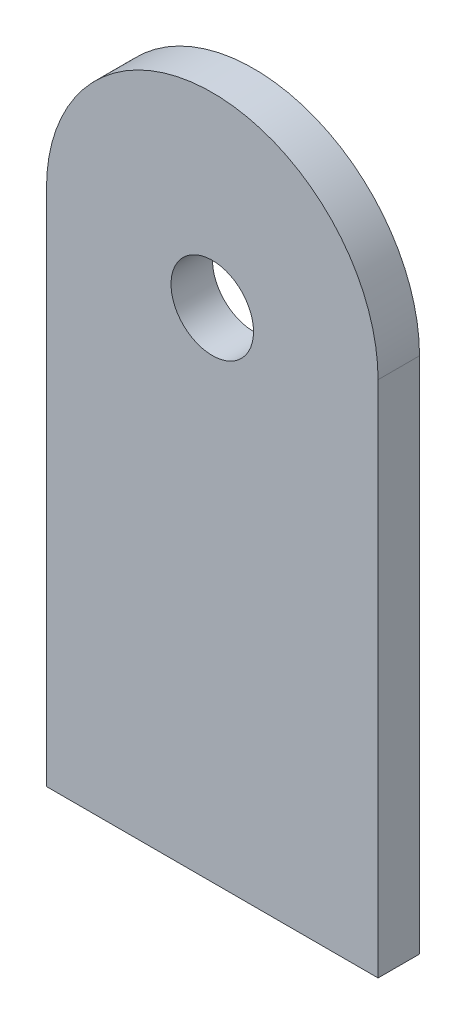
ISO-10303-21;
HEADER;
FILE_DESCRIPTION(('STEP AP214'),'2;1');
FILE_NAME('part.step','',(''),(''),'','','');
FILE_SCHEMA(('AUTOMOTIVE_DESIGN { 1 0 10303 214 1 1 1 1 }'));
ENDSEC;
DATA;
#1=APPLICATION_CONTEXT('core data for automotive mechanical design processes');
#2=APPLICATION_PROTOCOL_DEFINITION('international standard','automotive_design',2000,#1);
#3=PRODUCT_CONTEXT('',#1,'mechanical');
#4=PRODUCT('Part','Part','',(#3));
#5=PRODUCT_RELATED_PRODUCT_CATEGORY('part','',(#4));
#6=PRODUCT_DEFINITION_FORMATION('','',#4);
#7=PRODUCT_DEFINITION_CONTEXT('part definition',#1,'design');
#8=PRODUCT_DEFINITION('design','',#6,#7);
#9=PRODUCT_DEFINITION_SHAPE('','',#8);
#10=(LENGTH_UNIT() NAMED_UNIT(*) SI_UNIT(.MILLI.,.METRE.));
#11=(NAMED_UNIT(*) PLANE_ANGLE_UNIT() SI_UNIT($,.RADIAN.));
#12=(NAMED_UNIT(*) SI_UNIT($,.STERADIAN.) SOLID_ANGLE_UNIT());
#13=UNCERTAINTY_MEASURE_WITH_UNIT(LENGTH_MEASURE(1.E-05),#10,'distance_accuracy_value','');
#14=(GEOMETRIC_REPRESENTATION_CONTEXT(3) GLOBAL_UNCERTAINTY_ASSIGNED_CONTEXT((#13)) GLOBAL_UNIT_ASSIGNED_CONTEXT((#10,
#11,#12)) REPRESENTATION_CONTEXT('',''));
#15=CARTESIAN_POINT('',(0.,0.,0.));
#16=DIRECTION('',(0.,0.,1.));
#17=DIRECTION('',(1.,0.,0.));
#18=AXIS2_PLACEMENT_3D('',#15,#16,#17);
#19=CARTESIAN_POINT('',(0.,609.6,0.));
#20=DIRECTION('',(1.,0.,0.));
#21=DIRECTION('',(0.,0.,-1.));
#22=AXIS2_PLACEMENT_3D('',#19,#20,#21);
#23=PLANE('',#22);
#24=DIRECTION('',(0.,0.,-1.));
#25=VECTOR('',#24,1.);
#26=CARTESIAN_POINT('',(-1.11022302462516E-13,317.5,0.));
#27=LINE('',#26,#25);
#28=CARTESIAN_POINT('',(-1.11022302462516E-13,317.5,0.));
#29=VERTEX_POINT('',#28);
#30=CARTESIAN_POINT('',(-1.11022302462516E-13,317.5,-25.4));
#31=VERTEX_POINT('',#30);
#32=EDGE_CURVE('E71',#29,#31,#27,.T.);
#33=ORIENTED_EDGE('',*,*,#32,.T.);
#34=DIRECTION('',(0.,-1.,0.));
#35=VECTOR('',#34,1.);
#36=CARTESIAN_POINT('',(0.,609.6,-25.4));
#37=LINE('',#36,#35);
#38=CARTESIAN_POINT('',(0.,0.,-25.4));
#39=VERTEX_POINT('',#38);
#40=EDGE_CURVE('E55',#31,#39,#37,.T.);
#41=ORIENTED_EDGE('',*,*,#40,.T.);
#42=DIRECTION('',(0.,0.,1.));
#43=VECTOR('',#42,1.);
#44=CARTESIAN_POINT('',(0.,0.,0.));
#45=LINE('',#44,#43);
#46=CARTESIAN_POINT('',(0.,0.,0.));
#47=VERTEX_POINT('',#46);
#48=EDGE_CURVE('E85',#39,#47,#45,.T.);
#49=ORIENTED_EDGE('',*,*,#48,.T.);
#50=DIRECTION('',(0.,-1.,0.));
#51=VECTOR('',#50,1.);
#52=CARTESIAN_POINT('',(0.,609.6,0.));
#53=LINE('',#52,#51);
#54=EDGE_CURVE('E11',#29,#47,#53,.T.);
#55=ORIENTED_EDGE('',*,*,#54,.F.);
#56=EDGE_LOOP('',(#33,#41,#49,#55));
#57=FACE_BOUND('',#56,.T.);
#58=ADVANCED_FACE('F33',(#57),#23,.F.);
#59=CARTESIAN_POINT('',(0.,609.6,0.));
#60=DIRECTION('',(0.,0.,-1.));
#61=DIRECTION('',(-1.,0.,0.));
#62=AXIS2_PLACEMENT_3D('',#59,#60,#61);
#63=PLANE('',#62);
#64=CARTESIAN_POINT('',(101.6,304.8,0.));
#65=DIRECTION('',(0.,0.,1.));
#66=DIRECTION('',(1.,0.,0.));
#67=AXIS2_PLACEMENT_3D('',#64,#65,#66);
#68=CIRCLE('',#67,25.273);
#69=CARTESIAN_POINT('',(126.873,304.8,0.));
#70=VERTEX_POINT('',#69);
#71=EDGE_CURVE('E94',#70,#70,#68,.T.);
#72=ORIENTED_EDGE('',*,*,#71,.F.);
#73=EDGE_LOOP('',(#72));
#74=FACE_BOUND('',#73,.T.);
#75=DIRECTION('',(0.,-1.,0.));
#76=VECTOR('',#75,1.);
#77=CARTESIAN_POINT('',(203.2,609.6,0.));
#78=LINE('',#77,#76);
#79=CARTESIAN_POINT('',(203.2,317.5,0.));
#80=VERTEX_POINT('',#79);
#81=CARTESIAN_POINT('',(203.2,0.,0.));
#82=VERTEX_POINT('',#81);
#83=EDGE_CURVE('E40',#80,#82,#78,.T.);
#84=ORIENTED_EDGE('',*,*,#83,.F.);
#85=CARTESIAN_POINT('',(101.6,317.5,0.));
#86=DIRECTION('',(0.,0.,1.));
#87=DIRECTION('',(1.,0.,0.));
#88=AXIS2_PLACEMENT_3D('',#85,#86,#87);
#89=CIRCLE('',#88,101.6);
#90=EDGE_CURVE('E74',#80,#29,#89,.T.);
#91=ORIENTED_EDGE('',*,*,#90,.T.);
#92=ORIENTED_EDGE('',*,*,#54,.T.);
#93=DIRECTION('',(1.,0.,0.));
#94=VECTOR('',#93,1.);
#95=CARTESIAN_POINT('',(0.,0.,0.));
#96=LINE('',#95,#94);
#97=EDGE_CURVE('E88',#47,#82,#96,.T.);
#98=ORIENTED_EDGE('',*,*,#97,.T.);
#99=EDGE_LOOP('',(#84,#91,#92,#98));
#100=FACE_BOUND('',#99,.T.);
#101=ADVANCED_FACE('F80',(#74,#100),#63,.F.);
#102=CARTESIAN_POINT('',(203.2,609.6,0.));
#103=DIRECTION('',(-1.,0.,0.));
#104=DIRECTION('',(0.,0.,1.));
#105=AXIS2_PLACEMENT_3D('',#102,#103,#104);
#106=PLANE('',#105);
#107=DIRECTION('',(0.,-1.,0.));
#108=VECTOR('',#107,1.);
#109=CARTESIAN_POINT('',(203.2,609.6,-25.4));
#110=LINE('',#109,#108);
#111=CARTESIAN_POINT('',(203.2,317.5,-25.4));
#112=VERTEX_POINT('',#111);
#113=CARTESIAN_POINT('',(203.2,0.,-25.4));
#114=VERTEX_POINT('',#113);
#115=EDGE_CURVE('E103',#112,#114,#110,.T.);
#116=ORIENTED_EDGE('',*,*,#115,.F.);
#117=DIRECTION('',(0.,0.,-1.));
#118=VECTOR('',#117,1.);
#119=CARTESIAN_POINT('',(203.2,317.5,0.));
#120=LINE('',#119,#118);
#121=EDGE_CURVE('E47',#80,#112,#120,.T.);
#122=ORIENTED_EDGE('',*,*,#121,.F.);
#123=ORIENTED_EDGE('',*,*,#83,.T.);
#124=DIRECTION('',(0.,0.,-1.));
#125=VECTOR('',#124,1.);
#126=CARTESIAN_POINT('',(203.2,0.,0.));
#127=LINE('',#126,#125);
#128=EDGE_CURVE('E91',#82,#114,#127,.T.);
#129=ORIENTED_EDGE('',*,*,#128,.T.);
#130=EDGE_LOOP('',(#116,#122,#123,#129));
#131=FACE_BOUND('',#130,.T.);
#132=ADVANCED_FACE('F106',(#131),#106,.F.);
#133=CARTESIAN_POINT('',(0.,609.6,-25.4));
#134=DIRECTION('',(0.,0.,1.));
#135=DIRECTION('',(1.,0.,0.));
#136=AXIS2_PLACEMENT_3D('',#133,#134,#135);
#137=PLANE('',#136);
#138=CARTESIAN_POINT('',(101.6,304.8,-25.4));
#139=DIRECTION('',(0.,0.,1.));
#140=DIRECTION('',(1.,0.,0.));
#141=AXIS2_PLACEMENT_3D('',#138,#139,#140);
#142=CIRCLE('',#141,25.273);
#143=CARTESIAN_POINT('',(126.873,304.8,-25.4));
#144=VERTEX_POINT('',#143);
#145=EDGE_CURVE('E89',#144,#144,#142,.T.);
#146=ORIENTED_EDGE('',*,*,#145,.T.);
#147=EDGE_LOOP('',(#146));
#148=FACE_BOUND('',#147,.T.);
#149=ORIENTED_EDGE('',*,*,#40,.F.);
#150=CARTESIAN_POINT('',(101.6,317.5,-25.4));
#151=DIRECTION('',(0.,0.,1.));
#152=DIRECTION('',(1.,0.,0.));
#153=AXIS2_PLACEMENT_3D('',#150,#151,#152);
#154=CIRCLE('',#153,101.6);
#155=EDGE_CURVE('E75',#112,#31,#154,.T.);
#156=ORIENTED_EDGE('',*,*,#155,.F.);
#157=ORIENTED_EDGE('',*,*,#115,.T.);
#158=DIRECTION('',(-1.,0.,0.));
#159=VECTOR('',#158,1.);
#160=CARTESIAN_POINT('',(0.,0.,-25.4));
#161=LINE('',#160,#159);
#162=EDGE_CURVE('E100',#114,#39,#161,.T.);
#163=ORIENTED_EDGE('',*,*,#162,.T.);
#164=EDGE_LOOP('',(#149,#156,#157,#163));
#165=FACE_BOUND('',#164,.T.);
#166=ADVANCED_FACE('F110',(#148,#165),#137,.F.);
#167=CARTESIAN_POINT('',(0.,0.,0.));
#168=DIRECTION('',(0.,-1.,0.));
#169=DIRECTION('',(0.,0.,-1.));
#170=AXIS2_PLACEMENT_3D('',#167,#168,#169);
#171=PLANE('',#170);
#172=ORIENTED_EDGE('',*,*,#48,.F.);
#173=ORIENTED_EDGE('',*,*,#162,.F.);
#174=ORIENTED_EDGE('',*,*,#128,.F.);
#175=ORIENTED_EDGE('',*,*,#97,.F.);
#176=EDGE_LOOP('',(#172,#173,#174,#175));
#177=FACE_BOUND('',#176,.T.);
#178=ADVANCED_FACE('F108',(#177),#171,.T.);
#179=CARTESIAN_POINT('',(101.6,304.8,-25.4));
#180=DIRECTION('',(0.,0.,1.));
#181=DIRECTION('',(1.,0.,0.));
#182=AXIS2_PLACEMENT_3D('',#179,#180,#181);
#183=CYLINDRICAL_SURFACE('',#182,25.273);
#184=ORIENTED_EDGE('',*,*,#145,.F.);
#185=EDGE_LOOP('',(#184));
#186=FACE_BOUND('',#185,.T.);
#187=ORIENTED_EDGE('',*,*,#71,.T.);
#188=EDGE_LOOP('',(#187));
#189=FACE_BOUND('',#188,.T.);
#190=ADVANCED_FACE('F116',(#186,#189),#183,.F.);
#191=CARTESIAN_POINT('',(101.6,317.5,0.));
#192=DIRECTION('',(0.,0.,-1.));
#193=DIRECTION('',(-1.,0.,0.));
#194=AXIS2_PLACEMENT_3D('',#191,#192,#193);
#195=CYLINDRICAL_SURFACE('',#194,101.6);
#196=ORIENTED_EDGE('',*,*,#155,.T.);
#197=ORIENTED_EDGE('',*,*,#32,.F.);
#198=ORIENTED_EDGE('',*,*,#90,.F.);
#199=ORIENTED_EDGE('',*,*,#121,.T.);
#200=EDGE_LOOP('',(#196,#197,#198,#199));
#201=FACE_BOUND('',#200,.T.);
#202=ADVANCED_FACE('F73',(#201),#195,.T.);
#203=CLOSED_SHELL('',(#58,#101,#132,#166,#178,#190,#202));
#204=MANIFOLD_SOLID_BREP('B2',#203);
#205=ADVANCED_BREP_SHAPE_REPRESENTATION('',(#18,#204),#14);
#206=SHAPE_DEFINITION_REPRESENTATION(#9,#205);
ENDSEC;
END-ISO-10303-21;
